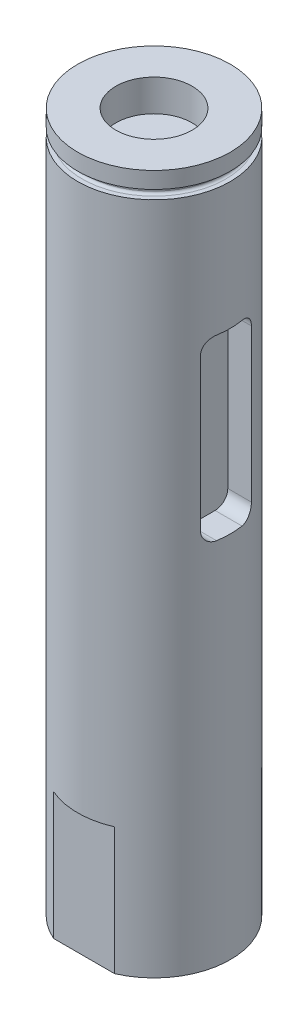
ISO-10303-21;
HEADER;
FILE_DESCRIPTION(('STEP AP214'),'2;1');
FILE_NAME('part.step','',(''),(''),'','','');
FILE_SCHEMA(('AUTOMOTIVE_DESIGN { 1 0 10303 214 1 1 1 1 }'));
ENDSEC;
DATA;
#1=APPLICATION_CONTEXT('core data for automotive mechanical design processes');
#2=APPLICATION_PROTOCOL_DEFINITION('international standard','automotive_design',2000,#1);
#3=PRODUCT_CONTEXT('',#1,'mechanical');
#4=PRODUCT('Part','Part','',(#3));
#5=PRODUCT_RELATED_PRODUCT_CATEGORY('part','',(#4));
#6=PRODUCT_DEFINITION_FORMATION('','',#4);
#7=PRODUCT_DEFINITION_CONTEXT('part definition',#1,'design');
#8=PRODUCT_DEFINITION('design','',#6,#7);
#9=PRODUCT_DEFINITION_SHAPE('','',#8);
#10=(LENGTH_UNIT() NAMED_UNIT(*) SI_UNIT(.MILLI.,.METRE.));
#11=(NAMED_UNIT(*) PLANE_ANGLE_UNIT() SI_UNIT($,.RADIAN.));
#12=(NAMED_UNIT(*) SI_UNIT($,.STERADIAN.) SOLID_ANGLE_UNIT());
#13=UNCERTAINTY_MEASURE_WITH_UNIT(LENGTH_MEASURE(1.E-05),#10,'distance_accuracy_value','');
#14=(GEOMETRIC_REPRESENTATION_CONTEXT(3) GLOBAL_UNCERTAINTY_ASSIGNED_CONTEXT((#13)) GLOBAL_UNIT_ASSIGNED_CONTEXT((#10,
#11,#12)) REPRESENTATION_CONTEXT('',''));
#15=CARTESIAN_POINT('',(0.,0.,0.));
#16=DIRECTION('',(0.,0.,1.));
#17=DIRECTION('',(1.,0.,0.));
#18=AXIS2_PLACEMENT_3D('',#15,#16,#17);
#19=CARTESIAN_POINT('',(0.,14.,0.));
#20=DIRECTION('',(0.,-1.,0.));
#21=DIRECTION('',(0.,0.,-1.));
#22=AXIS2_PLACEMENT_3D('',#19,#20,#21);
#23=CYLINDRICAL_SURFACE('',#22,6.);
#24=CARTESIAN_POINT('',(0.,26.,0.));
#25=DIRECTION('',(0.,1.,0.));
#26=DIRECTION('',(0.,0.,1.));
#27=AXIS2_PLACEMENT_3D('',#24,#25,#26);
#28=CIRCLE('',#27,6.);
#29=CARTESIAN_POINT('',(0.,26.,6.));
#30=VERTEX_POINT('',#29);
#31=EDGE_CURVE('E217',#30,#30,#28,.T.);
#32=ORIENTED_EDGE('',*,*,#31,.F.);
#33=EDGE_LOOP('',(#32));
#34=FACE_BOUND('',#33,.T.);
#35=CARTESIAN_POINT('',(0.,24.7,0.));
#36=DIRECTION('',(0.,-1.,0.));
#37=DIRECTION('',(0.,0.,-1.));
#38=AXIS2_PLACEMENT_3D('',#35,#36,#37);
#39=CIRCLE('',#38,6.);
#40=CARTESIAN_POINT('',(0.,24.7,-6.));
#41=VERTEX_POINT('',#40);
#42=EDGE_CURVE('E221',#41,#41,#39,.T.);
#43=ORIENTED_EDGE('',*,*,#42,.F.);
#44=EDGE_LOOP('',(#43));
#45=FACE_BOUND('',#44,.T.);
#46=ADVANCED_FACE('F39',(#34,#45),#23,.T.);
#47=CARTESIAN_POINT('',(0.,26.,0.));
#48=DIRECTION('',(0.,1.,0.));
#49=DIRECTION('',(0.,0.,1.));
#50=AXIS2_PLACEMENT_3D('',#47,#48,#49);
#51=PLANE('',#50);
#52=CARTESIAN_POINT('',(0.,26.,0.));
#53=DIRECTION('',(0.,1.,0.));
#54=DIRECTION('',(0.,0.,1.));
#55=AXIS2_PLACEMENT_3D('',#52,#53,#54);
#56=CIRCLE('',#55,3.);
#57=CARTESIAN_POINT('',(0.,26.,3.));
#58=VERTEX_POINT('',#57);
#59=EDGE_CURVE('E133',#58,#58,#56,.T.);
#60=ORIENTED_EDGE('',*,*,#59,.F.);
#61=EDGE_LOOP('',(#60));
#62=FACE_BOUND('',#61,.T.);
#63=ORIENTED_EDGE('',*,*,#31,.T.);
#64=EDGE_LOOP('',(#63));
#65=FACE_BOUND('',#64,.T.);
#66=ADVANCED_FACE('F300',(#62,#65),#51,.T.);
#67=CARTESIAN_POINT('',(-5.5030110244233,24.7,-1.28037871939337));
#68=DIRECTION('',(0.,-1.,0.));
#69=DIRECTION('',(0.,0.,-1.));
#70=AXIS2_PLACEMENT_3D('',#67,#68,#69);
#71=PLANE('',#70);
#72=CARTESIAN_POINT('',(0.,24.7,0.));
#73=DIRECTION('',(0.,-1.,0.));
#74=DIRECTION('',(0.,0.,-1.));
#75=AXIS2_PLACEMENT_3D('',#72,#73,#74);
#76=CIRCLE('',#75,5.64999999999998);
#77=CARTESIAN_POINT('',(0.,24.7,-5.64999999999998));
#78=VERTEX_POINT('',#77);
#79=EDGE_CURVE('E213',#78,#78,#76,.T.);
#80=ORIENTED_EDGE('',*,*,#79,.F.);
#81=EDGE_LOOP('',(#80));
#82=FACE_BOUND('',#81,.T.);
#83=ORIENTED_EDGE('',*,*,#42,.T.);
#84=EDGE_LOOP('',(#83));
#85=FACE_BOUND('',#84,.T.);
#86=ADVANCED_FACE('F306',(#82,#85),#71,.T.);
#87=CARTESIAN_POINT('',(-6.98833700889154,24.,-1.6259676657783));
#88=DIRECTION('',(0.,1.,0.));
#89=DIRECTION('',(0.,0.,1.));
#90=AXIS2_PLACEMENT_3D('',#87,#88,#89);
#91=PLANE('',#90);
#92=CARTESIAN_POINT('',(0.,24.,0.));
#93=DIRECTION('',(0.,-1.,0.));
#94=DIRECTION('',(0.,0.,-1.));
#95=AXIS2_PLACEMENT_3D('',#92,#93,#94);
#96=CIRCLE('',#95,5.64999999999998);
#97=CARTESIAN_POINT('',(0.,24.,-5.64999999999998));
#98=VERTEX_POINT('',#97);
#99=EDGE_CURVE('E185',#98,#98,#96,.T.);
#100=ORIENTED_EDGE('',*,*,#99,.T.);
#101=EDGE_LOOP('',(#100));
#102=FACE_BOUND('',#101,.T.);
#103=CARTESIAN_POINT('',(0.,24.,0.));
#104=DIRECTION('',(0.,1.,0.));
#105=DIRECTION('',(0.,0.,1.));
#106=AXIS2_PLACEMENT_3D('',#103,#104,#105);
#107=CIRCLE('',#106,6.);
#108=CARTESIAN_POINT('',(0.,24.,6.));
#109=VERTEX_POINT('',#108);
#110=EDGE_CURVE('E216',#109,#109,#107,.T.);
#111=ORIENTED_EDGE('',*,*,#110,.T.);
#112=EDGE_LOOP('',(#111));
#113=FACE_BOUND('',#112,.T.);
#114=ADVANCED_FACE('F264',(#102,#113),#91,.T.);
#115=CARTESIAN_POINT('',(0.,24.5,0.));
#116=DIRECTION('',(0.,-1.,0.));
#117=DIRECTION('',(0.,0.,-1.));
#118=AXIS2_PLACEMENT_3D('',#115,#116,#117);
#119=TOROIDAL_SURFACE('',#118,5.64999999999998,0.199999999999999);
#120=ORIENTED_EDGE('',*,*,#79,.T.);
#121=EDGE_LOOP('',(#120));
#122=FACE_BOUND('',#121,.T.);
#123=CARTESIAN_POINT('',(0.,24.5,0.));
#124=DIRECTION('',(0.,-1.,0.));
#125=DIRECTION('',(0.,0.,-1.));
#126=AXIS2_PLACEMENT_3D('',#123,#124,#125);
#127=CIRCLE('',#126,5.44999999999998);
#128=CARTESIAN_POINT('',(0.,24.5,-5.44999999999998));
#129=VERTEX_POINT('',#128);
#130=EDGE_CURVE('E210',#129,#129,#127,.T.);
#131=ORIENTED_EDGE('',*,*,#130,.F.);
#132=EDGE_LOOP('',(#131));
#133=FACE_BOUND('',#132,.T.);
#134=ADVANCED_FACE('F320',(#122,#133),#119,.F.);
#135=CARTESIAN_POINT('',(0.,60.2246155762171,0.));
#136=DIRECTION('',(0.,-1.,0.));
#137=DIRECTION('',(0.,0.,-1.));
#138=AXIS2_PLACEMENT_3D('',#135,#136,#137);
#139=CYLINDRICAL_SURFACE('',#138,5.44999999999998);
#140=ORIENTED_EDGE('',*,*,#130,.T.);
#141=EDGE_LOOP('',(#140));
#142=FACE_BOUND('',#141,.T.);
#143=CARTESIAN_POINT('',(0.,24.2,0.));
#144=DIRECTION('',(0.,-1.,0.));
#145=DIRECTION('',(0.,0.,-1.));
#146=AXIS2_PLACEMENT_3D('',#143,#144,#145);
#147=CIRCLE('',#146,5.44999999999998);
#148=CARTESIAN_POINT('',(0.,24.2,-5.44999999999998));
#149=VERTEX_POINT('',#148);
#150=EDGE_CURVE('E207',#149,#149,#147,.T.);
#151=ORIENTED_EDGE('',*,*,#150,.F.);
#152=EDGE_LOOP('',(#151));
#153=FACE_BOUND('',#152,.T.);
#154=ADVANCED_FACE('F315',(#142,#153),#139,.T.);
#155=CARTESIAN_POINT('',(0.,24.2,0.));
#156=DIRECTION('',(0.,-1.,0.));
#157=DIRECTION('',(0.,0.,-1.));
#158=AXIS2_PLACEMENT_3D('',#155,#156,#157);
#159=TOROIDAL_SURFACE('',#158,5.64999999999998,0.199999999999998);
#160=ORIENTED_EDGE('',*,*,#150,.T.);
#161=EDGE_LOOP('',(#160));
#162=FACE_BOUND('',#161,.T.);
#163=ORIENTED_EDGE('',*,*,#99,.F.);
#164=EDGE_LOOP('',(#163));
#165=FACE_BOUND('',#164,.T.);
#166=ADVANCED_FACE('F311',(#162,#165),#159,.F.);
#167=CARTESIAN_POINT('',(5.65685424949238,13.,2.));
#168=CARTESIAN_POINT('',(5.65685281758847,13.0271406195603,2.00000068443079));
#169=CARTESIAN_POINT('',(5.65724528085204,13.0542675920684,1.99889434448995));
#170=CARTESIAN_POINT('',(5.6588012761065,13.1083144843186,1.99448646917785));
#171=CARTESIAN_POINT('',(5.65996464010897,13.1352344478778,1.99118541206102));
#172=CARTESIAN_POINT('',(5.66457521184169,13.2152401355786,1.97804922022411));
#173=CARTESIAN_POINT('',(5.66914314724227,13.2677689800047,1.96498074668407));
#174=CARTESIAN_POINT('',(5.68090860038521,13.3697230095197,1.93069959561032));
#175=CARTESIAN_POINT('',(5.68810526955666,13.4191491901403,1.9094895461135));
#176=CARTESIAN_POINT('',(5.70460377121356,13.5137250019919,1.85961919606177));
#177=CARTESIAN_POINT('',(5.71390655255376,13.5588726926135,1.8309555366067));
#178=CARTESIAN_POINT('',(5.73431154730347,13.6451375632919,1.76602975759629));
#179=CARTESIAN_POINT('',(5.74546034987069,13.6860878211444,1.72956083672167));
#180=CARTESIAN_POINT('',(5.76864525641675,13.7613938194103,1.65058296050603));
#181=CARTESIAN_POINT('',(5.78068166050162,13.7957473151193,1.60807195773592));
#182=CARTESIAN_POINT('',(5.80552437460228,13.8584792321005,1.51600134393854));
#183=CARTESIAN_POINT('',(5.81834064122393,13.8865103779642,1.4662075429958));
#184=CARTESIAN_POINT('',(5.84349667083966,13.9337243082299,1.36249366414905));
#185=CARTESIAN_POINT('',(5.85583668949863,13.9529119024149,1.30857584784197));
#186=CARTESIAN_POINT('',(5.87643252247859,13.9781638653744,1.21215171656683));
#187=CARTESIAN_POINT('',(5.88492838409539,13.9863254878199,1.17023429589879));
#188=CARTESIAN_POINT('',(5.90113547403364,13.997246789207,1.08558012495498));
#189=CARTESIAN_POINT('',(5.9088471580345,14.0000096225441,1.04284386785744));
#190=CARTESIAN_POINT('',(5.91607978309962,14.,0.999999999999991));
#191=B_SPLINE_CURVE_WITH_KNOTS('',3,(#167,#168,#169,#170,#171,#172,#173,#174,#175,#176,#177,
#178,#179,#180,#181,#182,#183,#184,#185,#186,#187,#188,#189,#190),.UNSPECIFIED.,.F.,.F.,(4,2,2,
2,2,2,2,2,2,2,2,4),(0.,0.0813697321983587,0.162721738793672,0.32484161317144,0.486909200471364,
0.649049948975738,0.816183527372726,0.98337387653829,1.15825003972454,1.33303097964982,
1.46332089535386,1.59353466269523),.UNSPECIFIED.);
#192=CARTESIAN_POINT('',(5.65685424949238,13.,2.));
#193=VERTEX_POINT('',#192);
#194=CARTESIAN_POINT('',(5.91607978309962,14.,0.999999999999991));
#195=VERTEX_POINT('',#194);
#196=EDGE_CURVE('E11',#193,#195,#191,.T.);
#197=ORIENTED_EDGE('',*,*,#196,.T.);
#198=CARTESIAN_POINT('',(0.,14.,0.));
#199=DIRECTION('',(0.,1.,0.));
#200=DIRECTION('',(0.,0.,1.));
#201=AXIS2_PLACEMENT_3D('',#198,#199,#200);
#202=CIRCLE('',#201,6.);
#203=CARTESIAN_POINT('',(5.91607978309962,14.,-0.999999999999995));
#204=VERTEX_POINT('',#203);
#205=EDGE_CURVE('E220',#195,#204,#202,.T.);
#206=ORIENTED_EDGE('',*,*,#205,.T.);
#207=CARTESIAN_POINT('',(5.91607978309962,14.,-0.999999999999995));
#208=CARTESIAN_POINT('',(5.90640201240202,14.0000405759305,-1.05744405022136));
#209=CARTESIAN_POINT('',(5.89583336415347,13.9950540251957,-1.11469490219437));
#210=CARTESIAN_POINT('',(5.87342883441462,13.9755064421206,-1.22719911952359));
#211=CARTESIAN_POINT('',(5.86159482267549,13.9609593774531,-1.28245527503211));
#212=CARTESIAN_POINT('',(5.83714545083267,13.9227718025127,-1.3895245154396));
#213=CARTESIAN_POINT('',(5.82453024988558,13.8991331394476,-1.44133829724499));
#214=CARTESIAN_POINT('',(5.79916937690871,13.8434427114986,-1.54020609997988));
#215=CARTESIAN_POINT('',(5.78642367719668,13.8113891245001,-1.58725908697602));
#216=CARTESIAN_POINT('',(5.76135962724091,13.7391715845628,-1.67597570419013));
#217=CARTESIAN_POINT('',(5.74904982620252,13.6988997432736,-1.71755407861729));
#218=CARTESIAN_POINT('',(5.72586828747516,13.6115398739341,-1.79332249125908));
#219=CARTESIAN_POINT('',(5.71499666127697,13.5644513180274,-1.82751195679762));
#220=CARTESIAN_POINT('',(5.69567987862656,13.465585087445,-1.88684681266635));
#221=CARTESIAN_POINT('',(5.68719561514925,13.4139038103449,-1.91213990115031));
#222=CARTESIAN_POINT('',(5.67310524768226,13.3066504059048,-1.95355076042549));
#223=CARTESIAN_POINT('',(5.66749538055871,13.2510834745676,-1.96968053077614));
#224=CARTESIAN_POINT('',(5.6613503883933,13.1625046523593,-1.98724803334924));
#225=CARTESIAN_POINT('',(5.65966926284069,13.1301979434468,-1.99202469666343));
#226=CARTESIAN_POINT('',(5.65741979831632,13.0652670547078,-1.99840074381591));
#227=CARTESIAN_POINT('',(5.65685035299174,13.0326432230228,-2.0000032865869));
#228=CARTESIAN_POINT('',(5.65685424949238,13.,-2.));
#229=B_SPLINE_CURVE_WITH_KNOTS('',3,(#207,#208,#209,#210,#211,#212,#213,#214,#215,#216,#217,
#218,#219,#220,#221,#222,#223,#224,#225,#226,#227,#228),.UNSPECIFIED.,.F.,.F.,(4,2,2,2,2,2,2,2,
2,2,4),(0.,0.174480157541033,0.34870596889463,0.522896400176898,0.697124580713412,
0.873807076246497,1.05050326061842,1.22410957268253,1.39748801643219,1.49543358137948,
1.59328162034533),.UNSPECIFIED.);
#230=CARTESIAN_POINT('',(5.65685424949238,13.,-2.));
#231=VERTEX_POINT('',#230);
#232=EDGE_CURVE('E231',#204,#231,#229,.T.);
#233=ORIENTED_EDGE('',*,*,#232,.T.);
#234=DIRECTION('',(0.,-1.,0.));
#235=VECTOR('',#234,1.);
#236=CARTESIAN_POINT('',(5.65685424949238,14.,-2.));
#237=LINE('',#236,#235);
#238=CARTESIAN_POINT('',(5.65685424949238,1.00000000000001,-2.));
#239=VERTEX_POINT('',#238);
#240=EDGE_CURVE('E274',#231,#239,#237,.T.);
#241=ORIENTED_EDGE('',*,*,#240,.T.);
#242=CARTESIAN_POINT('',(5.65685424949238,1.00000000000001,-2.));
#243=CARTESIAN_POINT('',(5.65685281758846,0.972859380439662,-2.00000068443079));
#244=CARTESIAN_POINT('',(5.65724528085204,0.945732407931599,-1.99889434448995));
#245=CARTESIAN_POINT('',(5.6588012761065,0.891685515681443,-1.99448646917786));
#246=CARTESIAN_POINT('',(5.65996464010897,0.864765552122218,-1.99118541206103));
#247=CARTESIAN_POINT('',(5.66457521184169,0.784759864421369,-1.97804922022412));
#248=CARTESIAN_POINT('',(5.66914314724227,0.732231019995348,-1.96498074668407));
#249=CARTESIAN_POINT('',(5.68090860038521,0.630276990480267,-1.93069959561032));
#250=CARTESIAN_POINT('',(5.68810526955666,0.580850809859671,-1.90948954611351));
#251=CARTESIAN_POINT('',(5.70460377121355,0.486274998008095,-1.85961919606177));
#252=CARTESIAN_POINT('',(5.71390655255376,0.441127307386551,-1.8309555366067));
#253=CARTESIAN_POINT('',(5.73431154730347,0.35486243670811,-1.76602975759629));
#254=CARTESIAN_POINT('',(5.74546034987069,0.313912178855592,-1.72956083672168));
#255=CARTESIAN_POINT('',(5.76864525641675,0.238606180589669,-1.65058296050604));
#256=CARTESIAN_POINT('',(5.78068166050162,0.204252684880717,-1.60807195773592));
#257=CARTESIAN_POINT('',(5.80552437460228,0.141520767899505,-1.51600134393854));
#258=CARTESIAN_POINT('',(5.81834064122393,0.113489622035831,-1.4662075429958));
#259=CARTESIAN_POINT('',(5.84349667083966,0.0662756917701232,-1.36249366414905));
#260=CARTESIAN_POINT('',(5.85583668949863,0.0470880975850982,-1.30857584784197));
#261=CARTESIAN_POINT('',(5.87643252247859,0.0218361346256207,-1.21215171656684));
#262=CARTESIAN_POINT('',(5.88492838409539,0.0136745121800794,-1.1702342958988));
#263=CARTESIAN_POINT('',(5.90113547403364,0.00275321079297573,-1.08558012495499));
#264=CARTESIAN_POINT('',(5.9088471580345,-9.62254404861712E-06,-1.04284386785744));
#265=CARTESIAN_POINT('',(5.91607978309962,0.,-0.999999999999996));
#266=B_SPLINE_CURVE_WITH_KNOTS('',3,(#242,#243,#244,#245,#246,#247,#248,#249,#250,#251,#252,
#253,#254,#255,#256,#257,#258,#259,#260,#261,#262,#263,#264,#265),.UNSPECIFIED.,.F.,.F.,(4,2,2,
2,2,2,2,2,2,2,2,4),(0.,0.0813697321983577,0.162721738793671,0.32484161317144,0.486909200471364,
0.649049948975738,0.816183527372726,0.983373876538293,1.15825003972454,1.33303097964982,
1.46332089535386,1.59353466269523),.UNSPECIFIED.);
#267=CARTESIAN_POINT('',(5.91607978309962,0.,-0.999999999999996));
#268=VERTEX_POINT('',#267);
#269=EDGE_CURVE('E52',#239,#268,#266,.T.);
#270=ORIENTED_EDGE('',*,*,#269,.T.);
#271=CARTESIAN_POINT('',(0.,0.,0.));
#272=DIRECTION('',(0.,-1.,0.));
#273=DIRECTION('',(0.,0.,-1.));
#274=AXIS2_PLACEMENT_3D('',#271,#272,#273);
#275=CIRCLE('',#274,6.);
#276=CARTESIAN_POINT('',(5.91607978309962,0.,0.999999999999989));
#277=VERTEX_POINT('',#276);
#278=EDGE_CURVE('E228',#268,#277,#275,.T.);
#279=ORIENTED_EDGE('',*,*,#278,.T.);
#280=CARTESIAN_POINT('',(5.91607978309962,0.,0.99999999999999));
#281=CARTESIAN_POINT('',(5.90640201240201,-4.05759305357382E-05,1.05744405022135));
#282=CARTESIAN_POINT('',(5.89583336415347,0.00494597480426904,1.11469490219436));
#283=CARTESIAN_POINT('',(5.87342883441462,0.0244935578794028,1.22719911952358));
#284=CARTESIAN_POINT('',(5.86159482267549,0.0390406225469024,1.28245527503211));
#285=CARTESIAN_POINT('',(5.83714545083268,0.077228197487285,1.38952451543959));
#286=CARTESIAN_POINT('',(5.82453024988558,0.100866860552415,1.44133829724499));
#287=CARTESIAN_POINT('',(5.79916937690871,0.156557288501386,1.54020609997988));
#288=CARTESIAN_POINT('',(5.78642367719668,0.188610875499884,1.58725908697602));
#289=CARTESIAN_POINT('',(5.76135962724091,0.26082841543718,1.67597570419013));
#290=CARTESIAN_POINT('',(5.74904982620252,0.301100256726368,1.71755407861728));
#291=CARTESIAN_POINT('',(5.72586828747516,0.388460126065906,1.79332249125907));
#292=CARTESIAN_POINT('',(5.71499666127698,0.43554868197257,1.82751195679762));
#293=CARTESIAN_POINT('',(5.69567987862656,0.534414912554957,1.88684681266634));
#294=CARTESIAN_POINT('',(5.68719561514925,0.586096189655145,1.91213990115031));
#295=CARTESIAN_POINT('',(5.67310524768226,0.693349594095185,1.95355076042549));
#296=CARTESIAN_POINT('',(5.66749538055871,0.748916525432396,1.96968053077614));
#297=CARTESIAN_POINT('',(5.6613503883933,0.83749534764073,1.98724803334924));
#298=CARTESIAN_POINT('',(5.65966926284069,0.869802056553253,1.99202469666342));
#299=CARTESIAN_POINT('',(5.65741979831632,0.934732945292193,1.99840074381591));
#300=CARTESIAN_POINT('',(5.65685035299174,0.967356776977183,2.0000032865869));
#301=CARTESIAN_POINT('',(5.65685424949238,1.00000000000001,2.));
#302=B_SPLINE_CURVE_WITH_KNOTS('',3,(#280,#281,#282,#283,#284,#285,#286,#287,#288,#289,#290,
#291,#292,#293,#294,#295,#296,#297,#298,#299,#300,#301),.UNSPECIFIED.,.F.,.F.,(4,2,2,2,2,2,2,2,
2,2,4),(0.,0.174480157541033,0.34870596889463,0.522896400176899,0.697124580713412,
0.8738070762465,1.05050326061842,1.22410957268253,1.39748801643219,1.49543358137948,
1.59328162034533),.UNSPECIFIED.);
#303=CARTESIAN_POINT('',(5.65685424949238,1.00000000000001,2.));
#304=VERTEX_POINT('',#303);
#305=EDGE_CURVE('E239',#277,#304,#302,.T.);
#306=ORIENTED_EDGE('',*,*,#305,.T.);
#307=DIRECTION('',(0.,-1.,0.));
#308=VECTOR('',#307,1.);
#309=CARTESIAN_POINT('',(5.65685424949238,14.,2.));
#310=LINE('',#309,#308);
#311=EDGE_CURVE('E272',#304,#193,#310,.F.);
#312=ORIENTED_EDGE('',*,*,#311,.T.);
#313=EDGE_LOOP('',(#197,#206,#233,#241,#270,#279,#306,#312));
#314=FACE_BOUND('',#313,.T.);
#315=ORIENTED_EDGE('',*,*,#110,.F.);
#316=EDGE_LOOP('',(#315));
#317=FACE_BOUND('',#316,.T.);
#318=CARTESIAN_POINT('',(0.,-19.,0.));
#319=DIRECTION('',(0.,-1.,0.));
#320=DIRECTION('',(0.,0.,-1.));
#321=AXIS2_PLACEMENT_3D('',#318,#319,#320);
#322=CIRCLE('',#321,6.);
#323=CARTESIAN_POINT('',(2.39791576165636,-19.,5.5));
#324=VERTEX_POINT('',#323);
#325=CARTESIAN_POINT('',(-2.39791576165636,-19.,5.5));
#326=VERTEX_POINT('',#325);
#327=EDGE_CURVE('E145',#324,#326,#322,.T.);
#328=ORIENTED_EDGE('',*,*,#327,.F.);
#329=DIRECTION('',(0.,-1.,0.));
#330=VECTOR('',#329,1.);
#331=CARTESIAN_POINT('',(2.39791576165636,-19.,5.5));
#332=LINE('',#331,#330);
#333=CARTESIAN_POINT('',(2.39791576165636,-29.,5.5));
#334=VERTEX_POINT('',#333);
#335=EDGE_CURVE('E151',#324,#334,#332,.T.);
#336=ORIENTED_EDGE('',*,*,#335,.T.);
#337=CARTESIAN_POINT('',(0.,-29.,0.));
#338=DIRECTION('',(0.,-1.,0.));
#339=DIRECTION('',(0.,0.,1.));
#340=AXIS2_PLACEMENT_3D('',#337,#338,#339);
#341=CIRCLE('',#340,6.);
#342=CARTESIAN_POINT('',(-2.39791576165636,-29.,5.5));
#343=VERTEX_POINT('',#342);
#344=EDGE_CURVE('E154',#343,#334,#341,.T.);
#345=ORIENTED_EDGE('',*,*,#344,.F.);
#346=DIRECTION('',(0.,-1.,0.));
#347=VECTOR('',#346,1.);
#348=CARTESIAN_POINT('',(-2.39791576165636,-19.,5.5));
#349=LINE('',#348,#347);
#350=EDGE_CURVE('E59',#326,#343,#349,.T.);
#351=ORIENTED_EDGE('',*,*,#350,.F.);
#352=EDGE_LOOP('',(#328,#336,#345,#351));
#353=FACE_BOUND('',#352,.T.);
#354=ADVANCED_FACE('F262',(#314,#317,#353),#23,.T.);
#355=CARTESIAN_POINT('',(3.8,1.,-1.));
#356=DIRECTION('',(1.,0.,0.));
#357=DIRECTION('',(0.,0.,-1.));
#358=AXIS2_PLACEMENT_3D('',#355,#356,#357);
#359=CYLINDRICAL_SURFACE('',#358,1.);
#360=DIRECTION('',(1.,0.,0.));
#361=VECTOR('',#360,1.);
#362=CARTESIAN_POINT('',(3.8,1.00000000000001,-2.));
#363=LINE('',#362,#361);
#364=CARTESIAN_POINT('',(3.8,1.00000000000001,-2.));
#365=VERTEX_POINT('',#364);
#366=EDGE_CURVE('E67',#365,#239,#363,.T.);
#367=ORIENTED_EDGE('',*,*,#366,.F.);
#368=CARTESIAN_POINT('',(3.8,1.,-1.));
#369=DIRECTION('',(1.,0.,0.));
#370=DIRECTION('',(0.,0.,-1.));
#371=AXIS2_PLACEMENT_3D('',#368,#369,#370);
#372=CIRCLE('',#371,1.);
#373=CARTESIAN_POINT('',(3.8,0.,-0.999999999999996));
#374=VERTEX_POINT('',#373);
#375=EDGE_CURVE('E158',#374,#365,#372,.T.);
#376=ORIENTED_EDGE('',*,*,#375,.F.);
#377=DIRECTION('',(1.,0.,0.));
#378=VECTOR('',#377,1.);
#379=CARTESIAN_POINT('',(3.8,0.,-0.999999999999996));
#380=LINE('',#379,#378);
#381=EDGE_CURVE('E182',#374,#268,#380,.T.);
#382=ORIENTED_EDGE('',*,*,#381,.T.);
#383=ORIENTED_EDGE('',*,*,#269,.F.);
#384=EDGE_LOOP('',(#367,#376,#382,#383));
#385=FACE_BOUND('',#384,.T.);
#386=ADVANCED_FACE('F257',(#385),#359,.F.);
#387=CARTESIAN_POINT('',(3.8,0.,0.999999999999989));
#388=DIRECTION('',(0.,-1.,0.));
#389=DIRECTION('',(0.,0.,-1.));
#390=AXIS2_PLACEMENT_3D('',#387,#388,#389);
#391=PLANE('',#390);
#392=ORIENTED_EDGE('',*,*,#381,.F.);
#393=DIRECTION('',(0.,0.,-1.));
#394=VECTOR('',#393,1.);
#395=CARTESIAN_POINT('',(3.8,0.,0.999999999999989));
#396=LINE('',#395,#394);
#397=CARTESIAN_POINT('',(3.8,0.,0.999999999999989));
#398=VERTEX_POINT('',#397);
#399=EDGE_CURVE('E179',#398,#374,#396,.T.);
#400=ORIENTED_EDGE('',*,*,#399,.F.);
#401=DIRECTION('',(1.,0.,0.));
#402=VECTOR('',#401,1.);
#403=CARTESIAN_POINT('',(3.8,0.,0.999999999999989));
#404=LINE('',#403,#402);
#405=EDGE_CURVE('E186',#398,#277,#404,.T.);
#406=ORIENTED_EDGE('',*,*,#405,.T.);
#407=ORIENTED_EDGE('',*,*,#278,.F.);
#408=EDGE_LOOP('',(#392,#400,#406,#407));
#409=FACE_BOUND('',#408,.T.);
#410=ADVANCED_FACE('F261',(#409),#391,.F.);
#411=CARTESIAN_POINT('',(3.8,1.,0.999999999999997));
#412=DIRECTION('',(1.,0.,0.));
#413=DIRECTION('',(0.,0.,-1.));
#414=AXIS2_PLACEMENT_3D('',#411,#412,#413);
#415=CYLINDRICAL_SURFACE('',#414,1.);
#416=ORIENTED_EDGE('',*,*,#405,.F.);
#417=CARTESIAN_POINT('',(3.8,1.,0.999999999999997));
#418=DIRECTION('',(1.,0.,0.));
#419=DIRECTION('',(0.,0.,-1.));
#420=AXIS2_PLACEMENT_3D('',#417,#418,#419);
#421=CIRCLE('',#420,1.);
#422=CARTESIAN_POINT('',(3.8,1.00000000000001,2.));
#423=VERTEX_POINT('',#422);
#424=EDGE_CURVE('E176',#423,#398,#421,.T.);
#425=ORIENTED_EDGE('',*,*,#424,.F.);
#426=DIRECTION('',(1.,0.,0.));
#427=VECTOR('',#426,1.);
#428=CARTESIAN_POINT('',(3.8,1.00000000000001,2.));
#429=LINE('',#428,#427);
#430=EDGE_CURVE('E189',#423,#304,#429,.T.);
#431=ORIENTED_EDGE('',*,*,#430,.T.);
#432=ORIENTED_EDGE('',*,*,#305,.F.);
#433=EDGE_LOOP('',(#416,#425,#431,#432));
#434=FACE_BOUND('',#433,.T.);
#435=ADVANCED_FACE('F280',(#434),#415,.F.);
#436=CARTESIAN_POINT('',(3.8,13.,2.));
#437=DIRECTION('',(0.,0.,1.));
#438=DIRECTION('',(0.,-1.,0.));
#439=AXIS2_PLACEMENT_3D('',#436,#437,#438);
#440=PLANE('',#439);
#441=ORIENTED_EDGE('',*,*,#430,.F.);
#442=DIRECTION('',(0.,-1.,0.));
#443=VECTOR('',#442,1.);
#444=CARTESIAN_POINT('',(3.8,13.,2.));
#445=LINE('',#444,#443);
#446=CARTESIAN_POINT('',(3.8,13.,2.));
#447=VERTEX_POINT('',#446);
#448=EDGE_CURVE('E173',#447,#423,#445,.T.);
#449=ORIENTED_EDGE('',*,*,#448,.F.);
#450=DIRECTION('',(1.,0.,0.));
#451=VECTOR('',#450,1.);
#452=CARTESIAN_POINT('',(3.8,13.,2.));
#453=LINE('',#452,#451);
#454=EDGE_CURVE('E192',#447,#193,#453,.T.);
#455=ORIENTED_EDGE('',*,*,#454,.T.);
#456=ORIENTED_EDGE('',*,*,#311,.F.);
#457=EDGE_LOOP('',(#441,#449,#455,#456));
#458=FACE_BOUND('',#457,.T.);
#459=ADVANCED_FACE('F289',(#458),#440,.F.);
#460=CARTESIAN_POINT('',(3.8,13.,0.999999999999998));
#461=DIRECTION('',(1.,0.,0.));
#462=DIRECTION('',(0.,0.,-1.));
#463=AXIS2_PLACEMENT_3D('',#460,#461,#462);
#464=CYLINDRICAL_SURFACE('',#463,1.);
#465=ORIENTED_EDGE('',*,*,#454,.F.);
#466=CARTESIAN_POINT('',(3.8,13.,0.999999999999998));
#467=DIRECTION('',(1.,0.,0.));
#468=DIRECTION('',(0.,0.,-1.));
#469=AXIS2_PLACEMENT_3D('',#466,#467,#468);
#470=CIRCLE('',#469,1.);
#471=CARTESIAN_POINT('',(3.8,14.,0.999999999999991));
#472=VERTEX_POINT('',#471);
#473=EDGE_CURVE('E170',#472,#447,#470,.T.);
#474=ORIENTED_EDGE('',*,*,#473,.F.);
#475=DIRECTION('',(1.,0.,0.));
#476=VECTOR('',#475,1.);
#477=CARTESIAN_POINT('',(3.8,14.,0.999999999999991));
#478=LINE('',#477,#476);
#479=EDGE_CURVE('E195',#472,#195,#478,.T.);
#480=ORIENTED_EDGE('',*,*,#479,.T.);
#481=ORIENTED_EDGE('',*,*,#196,.F.);
#482=EDGE_LOOP('',(#465,#474,#480,#481));
#483=FACE_BOUND('',#482,.T.);
#484=ADVANCED_FACE('F291',(#483),#464,.F.);
#485=CARTESIAN_POINT('',(3.8,14.,0.999999999999991));
#486=DIRECTION('',(0.,1.,0.));
#487=DIRECTION('',(0.,0.,1.));
#488=AXIS2_PLACEMENT_3D('',#485,#486,#487);
#489=PLANE('',#488);
#490=ORIENTED_EDGE('',*,*,#479,.F.);
#491=DIRECTION('',(0.,0.,1.));
#492=VECTOR('',#491,1.);
#493=CARTESIAN_POINT('',(3.8,14.,0.999999999999991));
#494=LINE('',#493,#492);
#495=CARTESIAN_POINT('',(3.8,14.,-0.999999999999995));
#496=VERTEX_POINT('',#495);
#497=EDGE_CURVE('E167',#496,#472,#494,.T.);
#498=ORIENTED_EDGE('',*,*,#497,.F.);
#499=DIRECTION('',(1.,0.,0.));
#500=VECTOR('',#499,1.);
#501=CARTESIAN_POINT('',(3.8,14.,-0.999999999999995));
#502=LINE('',#501,#500);
#503=EDGE_CURVE('E198',#496,#204,#502,.T.);
#504=ORIENTED_EDGE('',*,*,#503,.T.);
#505=ORIENTED_EDGE('',*,*,#205,.F.);
#506=EDGE_LOOP('',(#490,#498,#504,#505));
#507=FACE_BOUND('',#506,.T.);
#508=ADVANCED_FACE('F252',(#507),#489,.F.);
#509=CARTESIAN_POINT('',(3.8,13.,-1.));
#510=DIRECTION('',(1.,0.,0.));
#511=DIRECTION('',(0.,0.,-1.));
#512=AXIS2_PLACEMENT_3D('',#509,#510,#511);
#513=CYLINDRICAL_SURFACE('',#512,1.);
#514=ORIENTED_EDGE('',*,*,#503,.F.);
#515=CARTESIAN_POINT('',(3.8,13.,-1.));
#516=DIRECTION('',(1.,0.,0.));
#517=DIRECTION('',(0.,0.,1.));
#518=AXIS2_PLACEMENT_3D('',#515,#516,#517);
#519=CIRCLE('',#518,1.);
#520=CARTESIAN_POINT('',(3.8,13.,-2.));
#521=VERTEX_POINT('',#520);
#522=EDGE_CURVE('E164',#521,#496,#519,.T.);
#523=ORIENTED_EDGE('',*,*,#522,.F.);
#524=DIRECTION('',(1.,0.,0.));
#525=VECTOR('',#524,1.);
#526=CARTESIAN_POINT('',(3.8,13.,-2.));
#527=LINE('',#526,#525);
#528=EDGE_CURVE('E201',#521,#231,#527,.T.);
#529=ORIENTED_EDGE('',*,*,#528,.T.);
#530=ORIENTED_EDGE('',*,*,#232,.F.);
#531=EDGE_LOOP('',(#514,#523,#529,#530));
#532=FACE_BOUND('',#531,.T.);
#533=ADVANCED_FACE('F246',(#532),#513,.F.);
#534=CARTESIAN_POINT('',(3.8,13.,-2.));
#535=DIRECTION('',(0.,0.,-1.));
#536=DIRECTION('',(0.,1.,0.));
#537=AXIS2_PLACEMENT_3D('',#534,#535,#536);
#538=PLANE('',#537);
#539=ORIENTED_EDGE('',*,*,#528,.F.);
#540=DIRECTION('',(0.,1.,0.));
#541=VECTOR('',#540,1.);
#542=CARTESIAN_POINT('',(3.8,13.,-2.));
#543=LINE('',#542,#541);
#544=EDGE_CURVE('E161',#365,#521,#543,.T.);
#545=ORIENTED_EDGE('',*,*,#544,.F.);
#546=ORIENTED_EDGE('',*,*,#366,.T.);
#547=ORIENTED_EDGE('',*,*,#240,.F.);
#548=EDGE_LOOP('',(#539,#545,#546,#547));
#549=FACE_BOUND('',#548,.T.);
#550=ADVANCED_FACE('F251',(#549),#538,.F.);
#551=CARTESIAN_POINT('',(3.8,1.,-1.));
#552=DIRECTION('',(1.,0.,0.));
#553=DIRECTION('',(0.,0.,-1.));
#554=AXIS2_PLACEMENT_3D('',#551,#552,#553);
#555=PLANE('',#554);
#556=ORIENTED_EDGE('',*,*,#375,.T.);
#557=ORIENTED_EDGE('',*,*,#544,.T.);
#558=ORIENTED_EDGE('',*,*,#522,.T.);
#559=ORIENTED_EDGE('',*,*,#497,.T.);
#560=ORIENTED_EDGE('',*,*,#473,.T.);
#561=ORIENTED_EDGE('',*,*,#448,.T.);
#562=ORIENTED_EDGE('',*,*,#424,.T.);
#563=ORIENTED_EDGE('',*,*,#399,.T.);
#564=EDGE_LOOP('',(#556,#557,#558,#559,#560,#561,#562,#563));
#565=FACE_BOUND('',#564,.T.);
#566=ADVANCED_FACE('F256',(#565),#555,.T.);
#567=CARTESIAN_POINT('',(0.,-29.,0.));
#568=DIRECTION('',(0.,1.,0.));
#569=DIRECTION('',(0.,0.,1.));
#570=AXIS2_PLACEMENT_3D('',#567,#568,#569);
#571=PLANE('',#570);
#572=CARTESIAN_POINT('',(0.,-29.,0.));
#573=DIRECTION('',(0.,-1.,0.));
#574=DIRECTION('',(0.,0.,-1.));
#575=AXIS2_PLACEMENT_3D('',#572,#573,#574);
#576=CIRCLE('',#575,1.65);
#577=CARTESIAN_POINT('',(0.,-29.,-1.65));
#578=VERTEX_POINT('',#577);
#579=EDGE_CURVE('E134',#578,#578,#576,.T.);
#580=ORIENTED_EDGE('',*,*,#579,.F.);
#581=EDGE_LOOP('',(#580));
#582=FACE_BOUND('',#581,.T.);
#583=ORIENTED_EDGE('',*,*,#344,.T.);
#584=DIRECTION('',(1.,0.,0.));
#585=VECTOR('',#584,1.);
#586=CARTESIAN_POINT('',(-2.39791576165636,-29.,5.5));
#587=LINE('',#586,#585);
#588=EDGE_CURVE('E143',#343,#334,#587,.T.);
#589=ORIENTED_EDGE('',*,*,#588,.F.);
#590=EDGE_LOOP('',(#583,#589));
#591=FACE_BOUND('',#590,.T.);
#592=ADVANCED_FACE('F353',(#582,#591),#571,.F.);
#593=CARTESIAN_POINT('',(-2.39791576165636,-19.,5.5));
#594=DIRECTION('',(0.,0.,-1.));
#595=DIRECTION('',(-1.,0.,0.));
#596=AXIS2_PLACEMENT_3D('',#593,#594,#595);
#597=PLANE('',#596);
#598=ORIENTED_EDGE('',*,*,#588,.T.);
#599=ORIENTED_EDGE('',*,*,#335,.F.);
#600=DIRECTION('',(1.,0.,0.));
#601=VECTOR('',#600,1.);
#602=CARTESIAN_POINT('',(-2.39791576165636,-19.,5.5));
#603=LINE('',#602,#601);
#604=EDGE_CURVE('E147',#326,#324,#603,.T.);
#605=ORIENTED_EDGE('',*,*,#604,.F.);
#606=ORIENTED_EDGE('',*,*,#350,.T.);
#607=EDGE_LOOP('',(#598,#599,#605,#606));
#608=FACE_BOUND('',#607,.T.);
#609=ADVANCED_FACE('F351',(#608),#597,.F.);
#610=CARTESIAN_POINT('',(0.,-19.,0.));
#611=DIRECTION('',(0.,-1.,0.));
#612=DIRECTION('',(0.,0.,-1.));
#613=AXIS2_PLACEMENT_3D('',#610,#611,#612);
#614=PLANE('',#613);
#615=ORIENTED_EDGE('',*,*,#327,.T.);
#616=ORIENTED_EDGE('',*,*,#604,.T.);
#617=EDGE_LOOP('',(#615,#616));
#618=FACE_BOUND('',#617,.T.);
#619=ADVANCED_FACE('F350',(#618),#614,.T.);
#620=CARTESIAN_POINT('',(0.,23.5,0.));
#621=DIRECTION('',(0.,1.,0.));
#622=DIRECTION('',(0.,0.,1.));
#623=AXIS2_PLACEMENT_3D('',#620,#621,#622);
#624=CYLINDRICAL_SURFACE('',#623,3.);
#625=CARTESIAN_POINT('',(0.,23.5,0.));
#626=DIRECTION('',(0.,1.,0.));
#627=DIRECTION('',(0.,0.,1.));
#628=AXIS2_PLACEMENT_3D('',#625,#626,#627);
#629=CIRCLE('',#628,3.);
#630=CARTESIAN_POINT('',(0.,23.5,3.));
#631=VERTEX_POINT('',#630);
#632=EDGE_CURVE('E137',#631,#631,#629,.T.);
#633=ORIENTED_EDGE('',*,*,#632,.F.);
#634=EDGE_LOOP('',(#633));
#635=FACE_BOUND('',#634,.T.);
#636=ORIENTED_EDGE('',*,*,#59,.T.);
#637=EDGE_LOOP('',(#636));
#638=FACE_BOUND('',#637,.T.);
#639=ADVANCED_FACE('F424',(#635,#638),#624,.F.);
#640=CARTESIAN_POINT('',(0.,23.5,0.));
#641=DIRECTION('',(0.,1.,0.));
#642=DIRECTION('',(0.,0.,1.));
#643=AXIS2_PLACEMENT_3D('',#640,#641,#642);
#644=PLANE('',#643);
#645=ORIENTED_EDGE('',*,*,#632,.T.);
#646=EDGE_LOOP('',(#645));
#647=FACE_BOUND('',#646,.T.);
#648=ADVANCED_FACE('F127',(#647),#644,.T.);
#649=CARTESIAN_POINT('',(0.,-19.,0.));
#650=DIRECTION('',(0.,-1.,0.));
#651=DIRECTION('',(0.,0.,-1.));
#652=AXIS2_PLACEMENT_3D('',#649,#650,#651);
#653=CONICAL_SURFACE('',#652,1.65,1.02974425867665);
#654=CARTESIAN_POINT('',(0.,-18.0085799786045,0.));
#655=VERTEX_POINT('',#654);
#656=VERTEX_LOOP('',#655);
#657=FACE_BOUND('',#656,.T.);
#658=CARTESIAN_POINT('',(0.,-19.,0.));
#659=DIRECTION('',(0.,-1.,0.));
#660=DIRECTION('',(0.,0.,-1.));
#661=AXIS2_PLACEMENT_3D('',#658,#659,#660);
#662=CIRCLE('',#661,1.65);
#663=CARTESIAN_POINT('',(0.,-19.,-1.65));
#664=VERTEX_POINT('',#663);
#665=EDGE_CURVE('E131',#664,#664,#662,.T.);
#666=ORIENTED_EDGE('',*,*,#665,.T.);
#667=EDGE_LOOP('',(#666));
#668=FACE_BOUND('',#667,.T.);
#669=ADVANCED_FACE('F123',(#657,#668),#653,.F.);
#670=CARTESIAN_POINT('',(0.,-29.,0.));
#671=DIRECTION('',(0.,-1.,0.));
#672=DIRECTION('',(0.,0.,-1.));
#673=AXIS2_PLACEMENT_3D('',#670,#671,#672);
#674=CYLINDRICAL_SURFACE('',#673,1.65);
#675=ORIENTED_EDGE('',*,*,#665,.F.);
#676=EDGE_LOOP('',(#675));
#677=FACE_BOUND('',#676,.T.);
#678=ORIENTED_EDGE('',*,*,#579,.T.);
#679=EDGE_LOOP('',(#678));
#680=FACE_BOUND('',#679,.T.);
#681=ADVANCED_FACE('F126',(#677,#680),#674,.F.);
#682=CLOSED_SHELL('',(#46,#66,#86,#114,#134,#154,#166,#354,#386,#410,#435,#459,#484,#508,#533,
#550,#566,#592,#609,#619,#639,#648,#669,#681));
#683=MANIFOLD_SOLID_BREP('B2',#682);
#684=ADVANCED_BREP_SHAPE_REPRESENTATION('',(#18,#683),#14);
#685=SHAPE_DEFINITION_REPRESENTATION(#9,#684);
ENDSEC;
END-ISO-10303-21;
